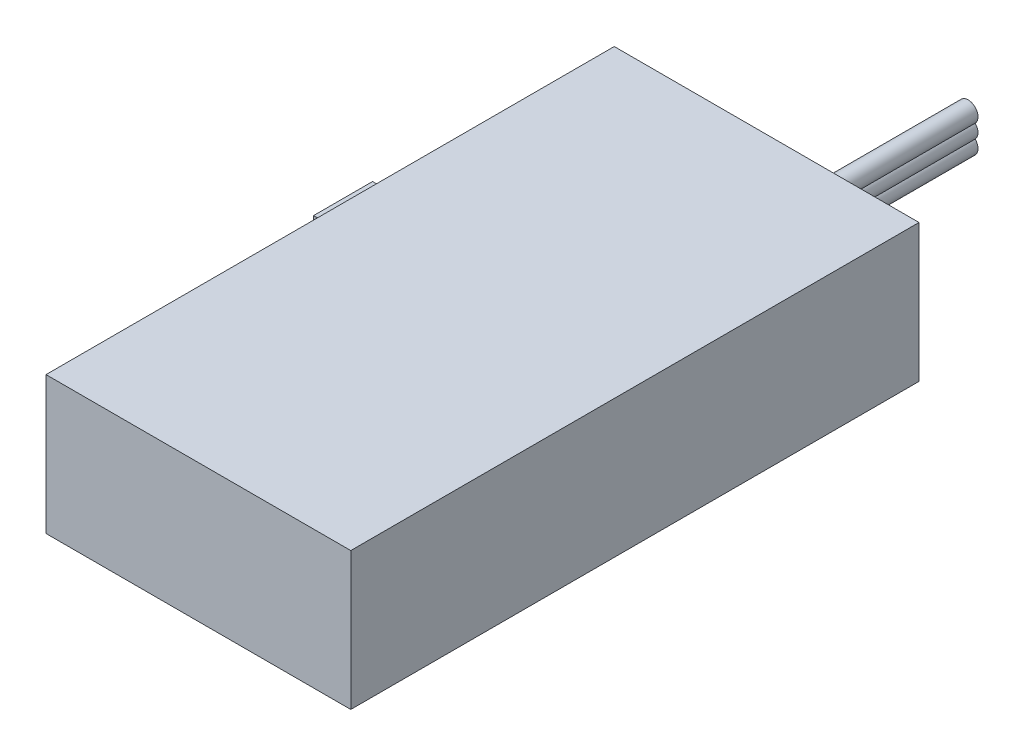
ISO-10303-21;
HEADER;
FILE_DESCRIPTION(('STEP AP214'),'2;1');
FILE_NAME('part.step','',(''),(''),'','','');
FILE_SCHEMA(('AUTOMOTIVE_DESIGN { 1 0 10303 214 1 1 1 1 }'));
ENDSEC;
DATA;
#1=APPLICATION_CONTEXT('core data for automotive mechanical design processes');
#2=APPLICATION_PROTOCOL_DEFINITION('international standard','automotive_design',2000,#1);
#3=PRODUCT_CONTEXT('',#1,'mechanical');
#4=PRODUCT('Part','Part','',(#3));
#5=PRODUCT_RELATED_PRODUCT_CATEGORY('part','',(#4));
#6=PRODUCT_DEFINITION_FORMATION('','',#4);
#7=PRODUCT_DEFINITION_CONTEXT('part definition',#1,'design');
#8=PRODUCT_DEFINITION('design','',#6,#7);
#9=PRODUCT_DEFINITION_SHAPE('','',#8);
#10=(LENGTH_UNIT() NAMED_UNIT(*) SI_UNIT(.MILLI.,.METRE.));
#11=(NAMED_UNIT(*) PLANE_ANGLE_UNIT() SI_UNIT($,.RADIAN.));
#12=(NAMED_UNIT(*) SI_UNIT($,.STERADIAN.) SOLID_ANGLE_UNIT());
#13=UNCERTAINTY_MEASURE_WITH_UNIT(LENGTH_MEASURE(1.E-05),#10,'distance_accuracy_value','');
#14=(GEOMETRIC_REPRESENTATION_CONTEXT(3) GLOBAL_UNCERTAINTY_ASSIGNED_CONTEXT((#13)) GLOBAL_UNIT_ASSIGNED_CONTEXT((#10,
#11,#12)) REPRESENTATION_CONTEXT('',''));
#15=CARTESIAN_POINT('',(0.,0.,0.));
#16=DIRECTION('',(0.,0.,1.));
#17=DIRECTION('',(1.,0.,0.));
#18=AXIS2_PLACEMENT_3D('',#15,#16,#17);
#19=CARTESIAN_POINT('',(-2.5,4.7,9.79204787270174));
#20=DIRECTION('',(0.,0.,1.));
#21=DIRECTION('',(1.,0.,0.));
#22=AXIS2_PLACEMENT_3D('',#19,#20,#21);
#23=PLANE('',#22);
#24=DIRECTION('',(0.,-1.,0.));
#25=VECTOR('',#24,1.);
#26=CARTESIAN_POINT('',(3.,4.7,9.79204787270174));
#27=LINE('',#26,#25);
#28=CARTESIAN_POINT('',(3.,4.7,9.79204787270174));
#29=VERTEX_POINT('',#28);
#30=CARTESIAN_POINT('',(3.,2.3,9.79204787270174));
#31=VERTEX_POINT('',#30);
#32=EDGE_CURVE('E125',#29,#31,#27,.T.);
#33=ORIENTED_EDGE('',*,*,#32,.T.);
#34=DIRECTION('',(1.,0.,0.));
#35=VECTOR('',#34,1.);
#36=CARTESIAN_POINT('',(-2.5,2.3,9.79204787270174));
#37=LINE('',#36,#35);
#38=CARTESIAN_POINT('',(-2.5,2.3,9.79204787270174));
#39=VERTEX_POINT('',#38);
#40=EDGE_CURVE('E13',#39,#31,#37,.T.);
#41=ORIENTED_EDGE('',*,*,#40,.F.);
#42=DIRECTION('',(0.,-1.,0.));
#43=VECTOR('',#42,1.);
#44=CARTESIAN_POINT('',(-2.5,4.7,9.79204787270174));
#45=LINE('',#44,#43);
#46=CARTESIAN_POINT('',(-2.5,4.7,9.79204787270174));
#47=VERTEX_POINT('',#46);
#48=EDGE_CURVE('E113',#47,#39,#45,.T.);
#49=ORIENTED_EDGE('',*,*,#48,.F.);
#50=DIRECTION('',(1.,0.,0.));
#51=VECTOR('',#50,1.);
#52=CARTESIAN_POINT('',(-2.5,4.7,9.79204787270174));
#53=LINE('',#52,#51);
#54=EDGE_CURVE('E121',#47,#29,#53,.T.);
#55=ORIENTED_EDGE('',*,*,#54,.T.);
#56=EDGE_LOOP('',(#33,#41,#49,#55));
#57=FACE_BOUND('',#56,.T.);
#58=ADVANCED_FACE('F62',(#57),#23,.F.);
#59=CARTESIAN_POINT('',(-2.5,2.3,9.79204787270174));
#60=DIRECTION('',(0.,1.,0.));
#61=DIRECTION('',(-1.,0.,0.));
#62=AXIS2_PLACEMENT_3D('',#59,#60,#61);
#63=PLANE('',#62);
#64=DIRECTION('',(0.,0.,1.));
#65=VECTOR('',#64,1.);
#66=CARTESIAN_POINT('',(3.,2.3,9.79204787270174));
#67=LINE('',#66,#65);
#68=CARTESIAN_POINT('',(3.,2.3,12.7920478727017));
#69=VERTEX_POINT('',#68);
#70=EDGE_CURVE('E117',#31,#69,#67,.T.);
#71=ORIENTED_EDGE('',*,*,#70,.T.);
#72=DIRECTION('',(1.,0.,0.));
#73=VECTOR('',#72,1.);
#74=CARTESIAN_POINT('',(-2.5,2.3,12.7920478727017));
#75=LINE('',#74,#73);
#76=CARTESIAN_POINT('',(-2.5,2.3,12.7920478727017));
#77=VERTEX_POINT('',#76);
#78=EDGE_CURVE('E70',#77,#69,#75,.T.);
#79=ORIENTED_EDGE('',*,*,#78,.F.);
#80=DIRECTION('',(0.,0.,1.));
#81=VECTOR('',#80,1.);
#82=CARTESIAN_POINT('',(-2.5,2.3,9.79204787270174));
#83=LINE('',#82,#81);
#84=EDGE_CURVE('E108',#39,#77,#83,.T.);
#85=ORIENTED_EDGE('',*,*,#84,.F.);
#86=ORIENTED_EDGE('',*,*,#40,.T.);
#87=EDGE_LOOP('',(#71,#79,#85,#86));
#88=FACE_BOUND('',#87,.T.);
#89=ADVANCED_FACE('F116',(#88),#63,.F.);
#90=CARTESIAN_POINT('',(-2.5,4.7,12.7920478727017));
#91=DIRECTION('',(0.,0.,-1.));
#92=DIRECTION('',(-1.,0.,0.));
#93=AXIS2_PLACEMENT_3D('',#90,#91,#92);
#94=PLANE('',#93);
#95=DIRECTION('',(0.,1.,0.));
#96=VECTOR('',#95,1.);
#97=CARTESIAN_POINT('',(3.,4.7,12.7920478727017));
#98=LINE('',#97,#96);
#99=CARTESIAN_POINT('',(3.,4.7,12.7920478727017));
#100=VERTEX_POINT('',#99);
#101=EDGE_CURVE('E95',#69,#100,#98,.T.);
#102=ORIENTED_EDGE('',*,*,#101,.T.);
#103=DIRECTION('',(1.,0.,0.));
#104=VECTOR('',#103,1.);
#105=CARTESIAN_POINT('',(-2.5,4.7,12.7920478727017));
#106=LINE('',#105,#104);
#107=CARTESIAN_POINT('',(-2.5,4.7,12.7920478727017));
#108=VERTEX_POINT('',#107);
#109=EDGE_CURVE('E118',#108,#100,#106,.T.);
#110=ORIENTED_EDGE('',*,*,#109,.F.);
#111=DIRECTION('',(0.,1.,0.));
#112=VECTOR('',#111,1.);
#113=CARTESIAN_POINT('',(-2.5,4.7,12.7920478727017));
#114=LINE('',#113,#112);
#115=EDGE_CURVE('E111',#77,#108,#114,.T.);
#116=ORIENTED_EDGE('',*,*,#115,.F.);
#117=ORIENTED_EDGE('',*,*,#78,.T.);
#118=EDGE_LOOP('',(#102,#110,#116,#117));
#119=FACE_BOUND('',#118,.T.);
#120=ADVANCED_FACE('F119',(#119),#94,.F.);
#121=CARTESIAN_POINT('',(-2.5,4.7,9.79204787270174));
#122=DIRECTION('',(0.,-1.,0.));
#123=DIRECTION('',(1.,0.,0.));
#124=AXIS2_PLACEMENT_3D('',#121,#122,#123);
#125=PLANE('',#124);
#126=DIRECTION('',(0.,0.,-1.));
#127=VECTOR('',#126,1.);
#128=CARTESIAN_POINT('',(3.,4.7,9.79204787270174));
#129=LINE('',#128,#127);
#130=EDGE_CURVE('E101',#100,#29,#129,.T.);
#131=ORIENTED_EDGE('',*,*,#130,.T.);
#132=ORIENTED_EDGE('',*,*,#54,.F.);
#133=DIRECTION('',(0.,0.,-1.));
#134=VECTOR('',#133,1.);
#135=CARTESIAN_POINT('',(-2.5,4.7,9.79204787270174));
#136=LINE('',#135,#134);
#137=EDGE_CURVE('E78',#108,#47,#136,.T.);
#138=ORIENTED_EDGE('',*,*,#137,.F.);
#139=ORIENTED_EDGE('',*,*,#109,.T.);
#140=EDGE_LOOP('',(#131,#132,#138,#139));
#141=FACE_BOUND('',#140,.T.);
#142=ADVANCED_FACE('F132',(#141),#125,.F.);
#143=CARTESIAN_POINT('',(-2.5,0.,0.));
#144=DIRECTION('',(-1.,0.,0.));
#145=DIRECTION('',(0.,0.,1.));
#146=AXIS2_PLACEMENT_3D('',#143,#144,#145);
#147=PLANE('',#146);
#148=ORIENTED_EDGE('',*,*,#48,.T.);
#149=ORIENTED_EDGE('',*,*,#84,.T.);
#150=ORIENTED_EDGE('',*,*,#115,.T.);
#151=ORIENTED_EDGE('',*,*,#137,.T.);
#152=EDGE_LOOP('',(#148,#149,#150,#151));
#153=FACE_BOUND('',#152,.T.);
#154=ADVANCED_FACE('F109',(#153),#147,.T.);
#155=CARTESIAN_POINT('',(3.,0.,0.));
#156=DIRECTION('',(-1.,0.,0.));
#157=DIRECTION('',(0.,0.,1.));
#158=AXIS2_PLACEMENT_3D('',#155,#156,#157);
#159=PLANE('',#158);
#160=ORIENTED_EDGE('',*,*,#32,.F.);
#161=ORIENTED_EDGE('',*,*,#130,.F.);
#162=ORIENTED_EDGE('',*,*,#101,.F.);
#163=ORIENTED_EDGE('',*,*,#70,.F.);
#164=EDGE_LOOP('',(#160,#161,#162,#163));
#165=FACE_BOUND('',#164,.T.);
#166=ADVANCED_FACE('F135',(#165),#159,.F.);
#167=CLOSED_SHELL('',(#58,#89,#120,#142,#154,#166));
#168=MANIFOLD_SOLID_BREP('B2',#167);
#169=CARTESIAN_POINT('',(0.,7.,0.));
#170=DIRECTION('',(1.,0.,0.));
#171=DIRECTION('',(0.,0.,-1.));
#172=AXIS2_PLACEMENT_3D('',#169,#170,#171);
#173=PLANE('',#172);
#174=DIRECTION('',(0.,0.,1.));
#175=VECTOR('',#174,1.);
#176=CARTESIAN_POINT('',(0.,2.3,2.3));
#177=LINE('',#176,#175);
#178=CARTESIAN_POINT('',(0.,2.3,2.3));
#179=VERTEX_POINT('',#178);
#180=CARTESIAN_POINT('',(0.,2.3,22.9));
#181=VERTEX_POINT('',#180);
#182=EDGE_CURVE('E336',#179,#181,#177,.T.);
#183=ORIENTED_EDGE('',*,*,#182,.F.);
#184=DIRECTION('',(0.,-1.,0.));
#185=VECTOR('',#184,1.);
#186=CARTESIAN_POINT('',(0.,4.7,2.3));
#187=LINE('',#186,#185);
#188=CARTESIAN_POINT('',(0.,4.7,2.3));
#189=VERTEX_POINT('',#188);
#190=EDGE_CURVE('E291',#189,#179,#187,.T.);
#191=ORIENTED_EDGE('',*,*,#190,.F.);
#192=DIRECTION('',(0.,0.,-1.));
#193=VECTOR('',#192,1.);
#194=CARTESIAN_POINT('',(0.,4.7,2.3));
#195=LINE('',#194,#193);
#196=CARTESIAN_POINT('',(0.,4.7,22.9));
#197=VERTEX_POINT('',#196);
#198=EDGE_CURVE('E325',#197,#189,#195,.T.);
#199=ORIENTED_EDGE('',*,*,#198,.F.);
#200=DIRECTION('',(0.,1.,0.));
#201=VECTOR('',#200,1.);
#202=CARTESIAN_POINT('',(0.,4.7,22.9));
#203=LINE('',#202,#201);
#204=EDGE_CURVE('E339',#181,#197,#203,.T.);
#205=ORIENTED_EDGE('',*,*,#204,.F.);
#206=EDGE_LOOP('',(#183,#191,#199,#205));
#207=FACE_BOUND('',#206,.T.);
#208=DIRECTION('',(0.,0.,1.));
#209=VECTOR('',#208,1.);
#210=CARTESIAN_POINT('',(0.,0.,0.));
#211=LINE('',#210,#209);
#212=CARTESIAN_POINT('',(0.,0.,0.));
#213=VERTEX_POINT('',#212);
#214=CARTESIAN_POINT('',(0.,0.,28.9));
#215=VERTEX_POINT('',#214);
#216=EDGE_CURVE('E346',#213,#215,#211,.T.);
#217=ORIENTED_EDGE('',*,*,#216,.T.);
#218=DIRECTION('',(0.,-1.,0.));
#219=VECTOR('',#218,1.);
#220=CARTESIAN_POINT('',(0.,7.,28.9));
#221=LINE('',#220,#219);
#222=CARTESIAN_POINT('',(0.,7.,28.9));
#223=VERTEX_POINT('',#222);
#224=EDGE_CURVE('E379',#223,#215,#221,.T.);
#225=ORIENTED_EDGE('',*,*,#224,.F.);
#226=DIRECTION('',(0.,0.,1.));
#227=VECTOR('',#226,1.);
#228=CARTESIAN_POINT('',(0.,7.,0.));
#229=LINE('',#228,#227);
#230=CARTESIAN_POINT('',(0.,7.,0.));
#231=VERTEX_POINT('',#230);
#232=EDGE_CURVE('E353',#231,#223,#229,.T.);
#233=ORIENTED_EDGE('',*,*,#232,.F.);
#234=DIRECTION('',(0.,-1.,0.));
#235=VECTOR('',#234,1.);
#236=CARTESIAN_POINT('',(0.,7.,0.));
#237=LINE('',#236,#235);
#238=EDGE_CURVE('E363',#231,#213,#237,.T.);
#239=ORIENTED_EDGE('',*,*,#238,.T.);
#240=EDGE_LOOP('',(#217,#225,#233,#239));
#241=FACE_BOUND('',#240,.T.);
#242=ADVANCED_FACE('F197',(#207,#241),#173,.F.);
#243=CARTESIAN_POINT('',(0.,7.,28.9));
#244=DIRECTION('',(0.,0.,-1.));
#245=DIRECTION('',(-1.,0.,0.));
#246=AXIS2_PLACEMENT_3D('',#243,#244,#245);
#247=PLANE('',#246);
#248=DIRECTION('',(1.,0.,0.));
#249=VECTOR('',#248,1.);
#250=CARTESIAN_POINT('',(0.,0.,28.9));
#251=LINE('',#250,#249);
#252=CARTESIAN_POINT('',(15.5,0.,28.9));
#253=VERTEX_POINT('',#252);
#254=EDGE_CURVE('E366',#215,#253,#251,.T.);
#255=ORIENTED_EDGE('',*,*,#254,.T.);
#256=DIRECTION('',(0.,-1.,0.));
#257=VECTOR('',#256,1.);
#258=CARTESIAN_POINT('',(15.5,7.,28.9));
#259=LINE('',#258,#257);
#260=CARTESIAN_POINT('',(15.5,7.,28.9));
#261=VERTEX_POINT('',#260);
#262=EDGE_CURVE('E376',#261,#253,#259,.T.);
#263=ORIENTED_EDGE('',*,*,#262,.F.);
#264=DIRECTION('',(1.,0.,0.));
#265=VECTOR('',#264,1.);
#266=CARTESIAN_POINT('',(0.,7.,28.9));
#267=LINE('',#266,#265);
#268=EDGE_CURVE('E356',#223,#261,#267,.T.);
#269=ORIENTED_EDGE('',*,*,#268,.F.);
#270=ORIENTED_EDGE('',*,*,#224,.T.);
#271=EDGE_LOOP('',(#255,#263,#269,#270));
#272=FACE_BOUND('',#271,.T.);
#273=ADVANCED_FACE('F424',(#272),#247,.F.);
#274=CARTESIAN_POINT('',(15.5,7.,0.));
#275=DIRECTION('',(-1.,0.,0.));
#276=DIRECTION('',(0.,0.,1.));
#277=AXIS2_PLACEMENT_3D('',#274,#275,#276);
#278=PLANE('',#277);
#279=DIRECTION('',(0.,0.,-1.));
#280=VECTOR('',#279,1.);
#281=CARTESIAN_POINT('',(15.5,0.,0.));
#282=LINE('',#281,#280);
#283=CARTESIAN_POINT('',(15.5,0.,0.));
#284=VERTEX_POINT('',#283);
#285=EDGE_CURVE('E368',#253,#284,#282,.T.);
#286=ORIENTED_EDGE('',*,*,#285,.T.);
#287=DIRECTION('',(0.,-1.,0.));
#288=VECTOR('',#287,1.);
#289=CARTESIAN_POINT('',(15.5,7.,0.));
#290=LINE('',#289,#288);
#291=CARTESIAN_POINT('',(15.5,7.,0.));
#292=VERTEX_POINT('',#291);
#293=EDGE_CURVE('E373',#292,#284,#290,.T.);
#294=ORIENTED_EDGE('',*,*,#293,.F.);
#295=DIRECTION('',(0.,0.,-1.));
#296=VECTOR('',#295,1.);
#297=CARTESIAN_POINT('',(15.5,7.,0.));
#298=LINE('',#297,#296);
#299=EDGE_CURVE('E359',#261,#292,#298,.T.);
#300=ORIENTED_EDGE('',*,*,#299,.F.);
#301=ORIENTED_EDGE('',*,*,#262,.T.);
#302=EDGE_LOOP('',(#286,#294,#300,#301));
#303=FACE_BOUND('',#302,.T.);
#304=ADVANCED_FACE('F428',(#303),#278,.F.);
#305=CARTESIAN_POINT('',(0.,7.,0.));
#306=DIRECTION('',(0.,0.,1.));
#307=DIRECTION('',(1.,0.,0.));
#308=AXIS2_PLACEMENT_3D('',#305,#306,#307);
#309=PLANE('',#308);
#310=CARTESIAN_POINT('',(9.,2.75,0.));
#311=DIRECTION('',(0.,0.,-1.));
#312=DIRECTION('',(-1.,0.,0.));
#313=AXIS2_PLACEMENT_3D('',#310,#311,#312);
#314=CIRCLE('',#313,0.500000000000001);
#315=CARTESIAN_POINT('',(9.35707142142715,3.1,0.));
#316=VERTEX_POINT('',#315);
#317=CARTESIAN_POINT('',(8.64292857857286,3.1,0.));
#318=VERTEX_POINT('',#317);
#319=EDGE_CURVE('E211',#316,#318,#314,.T.);
#320=ORIENTED_EDGE('',*,*,#319,.F.);
#321=CARTESIAN_POINT('',(9.,3.45,0.));
#322=DIRECTION('',(0.,0.,-1.));
#323=DIRECTION('',(-1.,0.,0.));
#324=AXIS2_PLACEMENT_3D('',#321,#322,#323);
#325=CIRCLE('',#324,0.500000000000001);
#326=CARTESIAN_POINT('',(9.35707142142715,3.8,0.));
#327=VERTEX_POINT('',#326);
#328=EDGE_CURVE('E216',#327,#316,#325,.T.);
#329=ORIENTED_EDGE('',*,*,#328,.F.);
#330=CARTESIAN_POINT('',(9.,4.15,0.));
#331=DIRECTION('',(0.,0.,-1.));
#332=DIRECTION('',(-1.,0.,0.));
#333=AXIS2_PLACEMENT_3D('',#330,#331,#332);
#334=CIRCLE('',#333,0.500000000000001);
#335=CARTESIAN_POINT('',(8.64292857857286,3.8,0.));
#336=VERTEX_POINT('',#335);
#337=EDGE_CURVE('E315',#336,#327,#334,.T.);
#338=ORIENTED_EDGE('',*,*,#337,.F.);
#339=EDGE_CURVE('E311',#318,#336,#325,.T.);
#340=ORIENTED_EDGE('',*,*,#339,.F.);
#341=EDGE_LOOP('',(#320,#329,#338,#340));
#342=FACE_BOUND('',#341,.T.);
#343=DIRECTION('',(-1.,0.,0.));
#344=VECTOR('',#343,1.);
#345=CARTESIAN_POINT('',(0.,0.,0.));
#346=LINE('',#345,#344);
#347=EDGE_CURVE('E357',#284,#213,#346,.T.);
#348=ORIENTED_EDGE('',*,*,#347,.T.);
#349=ORIENTED_EDGE('',*,*,#238,.F.);
#350=DIRECTION('',(-1.,0.,0.));
#351=VECTOR('',#350,1.);
#352=CARTESIAN_POINT('',(0.,7.,0.));
#353=LINE('',#352,#351);
#354=EDGE_CURVE('E361',#292,#231,#353,.T.);
#355=ORIENTED_EDGE('',*,*,#354,.F.);
#356=ORIENTED_EDGE('',*,*,#293,.T.);
#357=EDGE_LOOP('',(#348,#349,#355,#356));
#358=FACE_BOUND('',#357,.T.);
#359=ADVANCED_FACE('F433',(#342,#358),#309,.F.);
#360=CARTESIAN_POINT('',(0.,7.,0.));
#361=DIRECTION('',(0.,1.,0.));
#362=DIRECTION('',(0.,0.,1.));
#363=AXIS2_PLACEMENT_3D('',#360,#361,#362);
#364=PLANE('',#363);
#365=ORIENTED_EDGE('',*,*,#232,.T.);
#366=ORIENTED_EDGE('',*,*,#268,.T.);
#367=ORIENTED_EDGE('',*,*,#299,.T.);
#368=ORIENTED_EDGE('',*,*,#354,.T.);
#369=EDGE_LOOP('',(#365,#366,#367,#368));
#370=FACE_BOUND('',#369,.T.);
#371=ADVANCED_FACE('F417',(#370),#364,.T.);
#372=CARTESIAN_POINT('',(0.,0.,0.));
#373=DIRECTION('',(0.,1.,0.));
#374=DIRECTION('',(0.,0.,1.));
#375=AXIS2_PLACEMENT_3D('',#372,#373,#374);
#376=PLANE('',#375);
#377=ORIENTED_EDGE('',*,*,#216,.F.);
#378=ORIENTED_EDGE('',*,*,#347,.F.);
#379=ORIENTED_EDGE('',*,*,#285,.F.);
#380=ORIENTED_EDGE('',*,*,#254,.F.);
#381=EDGE_LOOP('',(#377,#378,#379,#380));
#382=FACE_BOUND('',#381,.T.);
#383=ADVANCED_FACE('F409',(#382),#376,.F.);
#384=CARTESIAN_POINT('',(8.,4.7,2.3));
#385=DIRECTION('',(0.,0.,-1.));
#386=DIRECTION('',(0.,1.,0.));
#387=AXIS2_PLACEMENT_3D('',#384,#385,#386);
#388=PLANE('',#387);
#389=CARTESIAN_POINT('',(3.4,3.5,2.3));
#390=DIRECTION('',(0.,0.,-1.));
#391=DIRECTION('',(0.,1.,0.));
#392=AXIS2_PLACEMENT_3D('',#389,#390,#391);
#393=CIRCLE('',#392,0.4);
#394=CARTESIAN_POINT('',(3.4,3.9,2.3));
#395=VERTEX_POINT('',#394);
#396=EDGE_CURVE('E60',#395,#395,#393,.F.);
#397=ORIENTED_EDGE('',*,*,#396,.F.);
#398=EDGE_LOOP('',(#397));
#399=FACE_BOUND('',#398,.T.);
#400=ORIENTED_EDGE('',*,*,#190,.T.);
#401=DIRECTION('',(-1.,0.,0.));
#402=VECTOR('',#401,1.);
#403=CARTESIAN_POINT('',(8.,2.3,2.3));
#404=LINE('',#403,#402);
#405=CARTESIAN_POINT('',(8.,2.3,2.3));
#406=VERTEX_POINT('',#405);
#407=EDGE_CURVE('E334',#406,#179,#404,.T.);
#408=ORIENTED_EDGE('',*,*,#407,.F.);
#409=DIRECTION('',(0.,-1.,0.));
#410=VECTOR('',#409,1.);
#411=CARTESIAN_POINT('',(8.,4.7,2.3));
#412=LINE('',#411,#410);
#413=CARTESIAN_POINT('',(8.,4.7,2.3));
#414=VERTEX_POINT('',#413);
#415=EDGE_CURVE('E321',#414,#406,#412,.T.);
#416=ORIENTED_EDGE('',*,*,#415,.F.);
#417=DIRECTION('',(-1.,0.,0.));
#418=VECTOR('',#417,1.);
#419=CARTESIAN_POINT('',(8.,4.7,2.3));
#420=LINE('',#419,#418);
#421=EDGE_CURVE('E344',#414,#189,#420,.T.);
#422=ORIENTED_EDGE('',*,*,#421,.T.);
#423=EDGE_LOOP('',(#400,#408,#416,#422));
#424=FACE_BOUND('',#423,.T.);
#425=ADVANCED_FACE('F407',(#399,#424),#388,.F.);
#426=CARTESIAN_POINT('',(8.,4.7,2.3));
#427=DIRECTION('',(0.,1.,0.));
#428=DIRECTION('',(0.,0.,1.));
#429=AXIS2_PLACEMENT_3D('',#426,#427,#428);
#430=PLANE('',#429);
#431=ORIENTED_EDGE('',*,*,#198,.T.);
#432=ORIENTED_EDGE('',*,*,#421,.F.);
#433=DIRECTION('',(0.,0.,-1.));
#434=VECTOR('',#433,1.);
#435=CARTESIAN_POINT('',(8.,4.7,2.3));
#436=LINE('',#435,#434);
#437=CARTESIAN_POINT('',(8.,4.7,22.9));
#438=VERTEX_POINT('',#437);
#439=EDGE_CURVE('E331',#438,#414,#436,.T.);
#440=ORIENTED_EDGE('',*,*,#439,.F.);
#441=DIRECTION('',(-1.,0.,0.));
#442=VECTOR('',#441,1.);
#443=CARTESIAN_POINT('',(8.,4.7,22.9));
#444=LINE('',#443,#442);
#445=EDGE_CURVE('E347',#438,#197,#444,.T.);
#446=ORIENTED_EDGE('',*,*,#445,.T.);
#447=EDGE_LOOP('',(#431,#432,#440,#446));
#448=FACE_BOUND('',#447,.T.);
#449=ADVANCED_FACE('F390',(#448),#430,.F.);
#450=CARTESIAN_POINT('',(8.,4.7,22.9));
#451=DIRECTION('',(0.,0.,1.));
#452=DIRECTION('',(1.,0.,0.));
#453=AXIS2_PLACEMENT_3D('',#450,#451,#452);
#454=PLANE('',#453);
#455=CARTESIAN_POINT('',(3.4,3.5,22.9));
#456=DIRECTION('',(0.,0.,1.));
#457=DIRECTION('',(1.,0.,0.));
#458=AXIS2_PLACEMENT_3D('',#455,#456,#457);
#459=CIRCLE('',#458,0.4);
#460=CARTESIAN_POINT('',(3.8,3.5,22.9));
#461=VERTEX_POINT('',#460);
#462=EDGE_CURVE('E204',#461,#461,#459,.F.);
#463=ORIENTED_EDGE('',*,*,#462,.F.);
#464=EDGE_LOOP('',(#463));
#465=FACE_BOUND('',#464,.T.);
#466=ORIENTED_EDGE('',*,*,#204,.T.);
#467=ORIENTED_EDGE('',*,*,#445,.F.);
#468=DIRECTION('',(0.,1.,0.));
#469=VECTOR('',#468,1.);
#470=CARTESIAN_POINT('',(8.,4.7,22.9));
#471=LINE('',#470,#469);
#472=CARTESIAN_POINT('',(8.,2.3,22.9));
#473=VERTEX_POINT('',#472);
#474=EDGE_CURVE('E328',#473,#438,#471,.T.);
#475=ORIENTED_EDGE('',*,*,#474,.F.);
#476=DIRECTION('',(-1.,0.,0.));
#477=VECTOR('',#476,1.);
#478=CARTESIAN_POINT('',(8.,2.3,22.9));
#479=LINE('',#478,#477);
#480=EDGE_CURVE('E349',#473,#181,#479,.T.);
#481=ORIENTED_EDGE('',*,*,#480,.T.);
#482=EDGE_LOOP('',(#466,#467,#475,#481));
#483=FACE_BOUND('',#482,.T.);
#484=ADVANCED_FACE('F386',(#465,#483),#454,.F.);
#485=CARTESIAN_POINT('',(8.,2.3,2.3));
#486=DIRECTION('',(0.,-1.,0.));
#487=DIRECTION('',(0.,0.,-1.));
#488=AXIS2_PLACEMENT_3D('',#485,#486,#487);
#489=PLANE('',#488);
#490=ORIENTED_EDGE('',*,*,#182,.T.);
#491=ORIENTED_EDGE('',*,*,#480,.F.);
#492=DIRECTION('',(0.,0.,1.));
#493=VECTOR('',#492,1.);
#494=CARTESIAN_POINT('',(8.,2.3,2.3));
#495=LINE('',#494,#493);
#496=EDGE_CURVE('E324',#406,#473,#495,.T.);
#497=ORIENTED_EDGE('',*,*,#496,.F.);
#498=ORIENTED_EDGE('',*,*,#407,.T.);
#499=EDGE_LOOP('',(#490,#491,#497,#498));
#500=FACE_BOUND('',#499,.T.);
#501=ADVANCED_FACE('F389',(#500),#489,.F.);
#502=CARTESIAN_POINT('',(8.,0.,0.));
#503=DIRECTION('',(-1.,0.,0.));
#504=DIRECTION('',(0.,0.,1.));
#505=AXIS2_PLACEMENT_3D('',#502,#503,#504);
#506=PLANE('',#505);
#507=ORIENTED_EDGE('',*,*,#415,.T.);
#508=ORIENTED_EDGE('',*,*,#496,.T.);
#509=ORIENTED_EDGE('',*,*,#474,.T.);
#510=ORIENTED_EDGE('',*,*,#439,.T.);
#511=EDGE_LOOP('',(#507,#508,#509,#510));
#512=FACE_BOUND('',#511,.T.);
#513=ADVANCED_FACE('F403',(#512),#506,.T.);
#514=CARTESIAN_POINT('',(3.4,3.5,28.902));
#515=DIRECTION('',(0.,0.,-1.));
#516=DIRECTION('',(-1.,0.,0.));
#517=AXIS2_PLACEMENT_3D('',#514,#515,#516);
#518=CYLINDRICAL_SURFACE('',#517,0.4);
#519=ORIENTED_EDGE('',*,*,#396,.T.);
#520=EDGE_LOOP('',(#519));
#521=FACE_BOUND('',#520,.T.);
#522=ORIENTED_EDGE('',*,*,#462,.T.);
#523=EDGE_LOOP('',(#522));
#524=FACE_BOUND('',#523,.T.);
#525=ADVANCED_FACE('F384',(#521,#524),#518,.T.);
#526=CARTESIAN_POINT('',(9.,2.75,-9.));
#527=DIRECTION('',(0.,0.,1.));
#528=DIRECTION('',(1.,0.,0.));
#529=AXIS2_PLACEMENT_3D('',#526,#527,#528);
#530=CYLINDRICAL_SURFACE('',#529,0.500000000000001);
#531=DIRECTION('',(0.,0.,1.));
#532=VECTOR('',#531,1.);
#533=CARTESIAN_POINT('',(8.64292857857286,3.1,-4.5));
#534=LINE('',#533,#532);
#535=CARTESIAN_POINT('',(8.64292857857286,3.1,-9.));
#536=VERTEX_POINT('',#535);
#537=EDGE_CURVE('E284',#536,#318,#534,.T.);
#538=ORIENTED_EDGE('',*,*,#537,.F.);
#539=CARTESIAN_POINT('',(9.,2.75,-9.));
#540=DIRECTION('',(0.,0.,-1.));
#541=DIRECTION('',(-1.,0.,0.));
#542=AXIS2_PLACEMENT_3D('',#539,#540,#541);
#543=CIRCLE('',#542,0.500000000000001);
#544=CARTESIAN_POINT('',(9.35707142142715,3.1,-9.));
#545=VERTEX_POINT('',#544);
#546=EDGE_CURVE('E288',#545,#536,#543,.T.);
#547=ORIENTED_EDGE('',*,*,#546,.F.);
#548=DIRECTION('',(0.,0.,1.));
#549=VECTOR('',#548,1.);
#550=CARTESIAN_POINT('',(9.35707142142715,3.1,-4.5));
#551=LINE('',#550,#549);
#552=EDGE_CURVE('E292',#316,#545,#551,.F.);
#553=ORIENTED_EDGE('',*,*,#552,.F.);
#554=ORIENTED_EDGE('',*,*,#319,.T.);
#555=EDGE_LOOP('',(#538,#547,#553,#554));
#556=FACE_BOUND('',#555,.T.);
#557=ADVANCED_FACE('F286',(#556),#530,.T.);
#558=CARTESIAN_POINT('',(9.,2.75,-9.));
#559=DIRECTION('',(0.,0.,-1.));
#560=DIRECTION('',(-1.,0.,0.));
#561=AXIS2_PLACEMENT_3D('',#558,#559,#560);
#562=PLANE('',#561);
#563=ORIENTED_EDGE('',*,*,#546,.T.);
#564=CARTESIAN_POINT('',(9.,3.45,-9.));
#565=DIRECTION('',(0.,0.,-1.));
#566=DIRECTION('',(-1.,0.,0.));
#567=AXIS2_PLACEMENT_3D('',#564,#565,#566);
#568=CIRCLE('',#567,0.500000000000001);
#569=CARTESIAN_POINT('',(8.64292857857286,3.8,-9.));
#570=VERTEX_POINT('',#569);
#571=EDGE_CURVE('E295',#536,#570,#568,.T.);
#572=ORIENTED_EDGE('',*,*,#571,.T.);
#573=CARTESIAN_POINT('',(9.,4.15,-9.));
#574=DIRECTION('',(0.,0.,-1.));
#575=DIRECTION('',(-1.,0.,0.));
#576=AXIS2_PLACEMENT_3D('',#573,#574,#575);
#577=CIRCLE('',#576,0.500000000000001);
#578=CARTESIAN_POINT('',(9.35707142142715,3.8,-9.));
#579=VERTEX_POINT('',#578);
#580=EDGE_CURVE('E313',#570,#579,#577,.T.);
#581=ORIENTED_EDGE('',*,*,#580,.T.);
#582=EDGE_CURVE('E302',#579,#545,#568,.T.);
#583=ORIENTED_EDGE('',*,*,#582,.T.);
#584=EDGE_LOOP('',(#563,#572,#581,#583));
#585=FACE_BOUND('',#584,.T.);
#586=ADVANCED_FACE('F305',(#585),#562,.T.);
#587=CARTESIAN_POINT('',(9.,4.15,-9.));
#588=DIRECTION('',(0.,0.,1.));
#589=DIRECTION('',(1.,0.,0.));
#590=AXIS2_PLACEMENT_3D('',#587,#588,#589);
#591=CYLINDRICAL_SURFACE('',#590,0.500000000000001);
#592=ORIENTED_EDGE('',*,*,#580,.F.);
#593=DIRECTION('',(0.,0.,1.));
#594=VECTOR('',#593,1.);
#595=CARTESIAN_POINT('',(8.64292857857286,3.8,-4.5));
#596=LINE('',#595,#594);
#597=EDGE_CURVE('E298',#570,#336,#596,.T.);
#598=ORIENTED_EDGE('',*,*,#597,.T.);
#599=ORIENTED_EDGE('',*,*,#337,.T.);
#600=DIRECTION('',(0.,0.,1.));
#601=VECTOR('',#600,1.);
#602=CARTESIAN_POINT('',(9.35707142142715,3.8,-4.5));
#603=LINE('',#602,#601);
#604=EDGE_CURVE('E318',#327,#579,#603,.F.);
#605=ORIENTED_EDGE('',*,*,#604,.T.);
#606=EDGE_LOOP('',(#592,#598,#599,#605));
#607=FACE_BOUND('',#606,.T.);
#608=ADVANCED_FACE('F539',(#607),#591,.T.);
#609=CARTESIAN_POINT('',(9.,3.45,-9.));
#610=DIRECTION('',(0.,0.,1.));
#611=DIRECTION('',(1.,0.,0.));
#612=AXIS2_PLACEMENT_3D('',#609,#610,#611);
#613=CYLINDRICAL_SURFACE('',#612,0.500000000000001);
#614=ORIENTED_EDGE('',*,*,#328,.T.);
#615=ORIENTED_EDGE('',*,*,#552,.T.);
#616=ORIENTED_EDGE('',*,*,#582,.F.);
#617=ORIENTED_EDGE('',*,*,#604,.F.);
#618=EDGE_LOOP('',(#614,#615,#616,#617));
#619=FACE_BOUND('',#618,.T.);
#620=ADVANCED_FACE('F549',(#619),#613,.T.);
#621=ORIENTED_EDGE('',*,*,#571,.F.);
#622=ORIENTED_EDGE('',*,*,#537,.T.);
#623=ORIENTED_EDGE('',*,*,#339,.T.);
#624=ORIENTED_EDGE('',*,*,#597,.F.);
#625=EDGE_LOOP('',(#621,#622,#623,#624));
#626=FACE_BOUND('',#625,.T.);
#627=ADVANCED_FACE('F296',(#626),#613,.T.);
#628=CLOSED_SHELL('',(#242,#273,#304,#359,#371,#383,#425,#449,#484,#501,#513,#525,#557,#586,
#608,#620,#627));
#629=MANIFOLD_SOLID_BREP('B7',#628);
#630=ADVANCED_BREP_SHAPE_REPRESENTATION('',(#18,#168,#629),#14);
#631=SHAPE_DEFINITION_REPRESENTATION(#9,#630);
ENDSEC;
END-ISO-10303-21;
